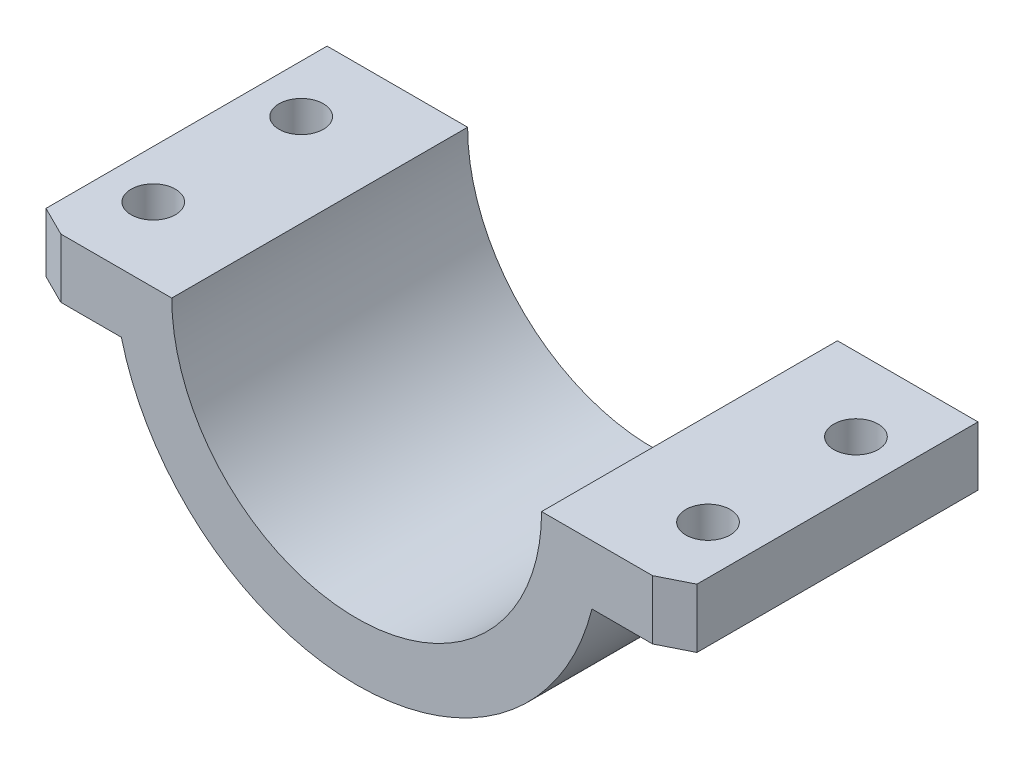
ISO-10303-21;
HEADER;
FILE_DESCRIPTION(('STEP AP214'),'2;1');
FILE_NAME('part.step','',(''),(''),'','','');
FILE_SCHEMA(('AUTOMOTIVE_DESIGN { 1 0 10303 214 1 1 1 1 }'));
ENDSEC;
DATA;
#1=APPLICATION_CONTEXT('core data for automotive mechanical design processes');
#2=APPLICATION_PROTOCOL_DEFINITION('international standard','automotive_design',2000,#1);
#3=PRODUCT_CONTEXT('',#1,'mechanical');
#4=PRODUCT('Part','Part','',(#3));
#5=PRODUCT_RELATED_PRODUCT_CATEGORY('part','',(#4));
#6=PRODUCT_DEFINITION_FORMATION('','',#4);
#7=PRODUCT_DEFINITION_CONTEXT('part definition',#1,'design');
#8=PRODUCT_DEFINITION('design','',#6,#7);
#9=PRODUCT_DEFINITION_SHAPE('','',#8);
#10=(LENGTH_UNIT() NAMED_UNIT(*) SI_UNIT(.MILLI.,.METRE.));
#11=(NAMED_UNIT(*) PLANE_ANGLE_UNIT() SI_UNIT($,.RADIAN.));
#12=(NAMED_UNIT(*) SI_UNIT($,.STERADIAN.) SOLID_ANGLE_UNIT());
#13=UNCERTAINTY_MEASURE_WITH_UNIT(LENGTH_MEASURE(1.E-05),#10,'distance_accuracy_value','');
#14=(GEOMETRIC_REPRESENTATION_CONTEXT(3) GLOBAL_UNCERTAINTY_ASSIGNED_CONTEXT((#13)) GLOBAL_UNIT_ASSIGNED_CONTEXT((#10,
#11,#12)) REPRESENTATION_CONTEXT('',''));
#15=CARTESIAN_POINT('',(0.,0.,0.));
#16=DIRECTION('',(0.,0.,1.));
#17=DIRECTION('',(1.,0.,0.));
#18=AXIS2_PLACEMENT_3D('',#15,#16,#17);
#19=CARTESIAN_POINT('',(-54.9481243354495,7.89485676799961,20.));
#20=DIRECTION('',(1.,0.,0.));
#21=DIRECTION('',(0.,0.,-1.));
#22=AXIS2_PLACEMENT_3D('',#19,#20,#21);
#23=PLANE('',#22);
#24=DIRECTION('',(0.,0.,-1.));
#25=VECTOR('',#24,1.);
#26=CARTESIAN_POINT('',(-54.9481243354495,7.89485676799961,20.));
#27=LINE('',#26,#25);
#28=CARTESIAN_POINT('',(-54.9481243354495,7.89485676799961,19.));
#29=VERTEX_POINT('',#28);
#30=CARTESIAN_POINT('',(-54.9481243354495,7.89485676799961,0.));
#31=VERTEX_POINT('',#30);
#32=EDGE_CURVE('E160',#29,#31,#27,.T.);
#33=ORIENTED_EDGE('',*,*,#32,.F.);
#34=DIRECTION('',(0.,1.,0.));
#35=VECTOR('',#34,1.);
#36=CARTESIAN_POINT('',(-54.9481243354495,-4.50514323200038,19.));
#37=LINE('',#36,#35);
#38=CARTESIAN_POINT('',(-54.9481243354495,11.8948567679996,19.));
#39=VERTEX_POINT('',#38);
#40=EDGE_CURVE('E178',#29,#39,#37,.T.);
#41=ORIENTED_EDGE('',*,*,#40,.T.);
#42=DIRECTION('',(0.,0.,-1.));
#43=VECTOR('',#42,1.);
#44=CARTESIAN_POINT('',(-54.9481243354495,11.8948567679996,20.));
#45=LINE('',#44,#43);
#46=CARTESIAN_POINT('',(-54.9481243354495,11.8948567679996,0.));
#47=VERTEX_POINT('',#46);
#48=EDGE_CURVE('E176',#39,#47,#45,.T.);
#49=ORIENTED_EDGE('',*,*,#48,.T.);
#50=DIRECTION('',(0.,-1.,0.));
#51=VECTOR('',#50,1.);
#52=CARTESIAN_POINT('',(-54.9481243354495,7.89485676799961,0.));
#53=LINE('',#52,#51);
#54=EDGE_CURVE('E192',#47,#31,#53,.T.);
#55=ORIENTED_EDGE('',*,*,#54,.T.);
#56=EDGE_LOOP('',(#33,#41,#49,#55));
#57=FACE_BOUND('',#56,.T.);
#58=ADVANCED_FACE('F43',(#57),#23,.F.);
#59=CARTESIAN_POINT('',(-48.8528406171064,7.89485676799961,20.));
#60=DIRECTION('',(0.,1.,0.));
#61=DIRECTION('',(0.,0.,1.));
#62=AXIS2_PLACEMENT_3D('',#59,#60,#61);
#63=PLANE('',#62);
#64=CARTESIAN_POINT('',(-51.6981243354495,7.89485676799961,15.));
#65=DIRECTION('',(0.,1.,0.));
#66=DIRECTION('',(0.,0.,1.));
#67=AXIS2_PLACEMENT_3D('',#64,#65,#66);
#68=CIRCLE('',#67,1.5);
#69=CARTESIAN_POINT('',(-51.6981243354495,7.89485676799961,16.5));
#70=VERTEX_POINT('',#69);
#71=EDGE_CURVE('E256',#70,#70,#68,.T.);
#72=ORIENTED_EDGE('',*,*,#71,.T.);
#73=EDGE_LOOP('',(#72));
#74=FACE_BOUND('',#73,.T.);
#75=CARTESIAN_POINT('',(-51.6981243354495,7.89485676799961,5.));
#76=DIRECTION('',(0.,1.,0.));
#77=DIRECTION('',(0.,0.,1.));
#78=AXIS2_PLACEMENT_3D('',#75,#76,#77);
#79=CIRCLE('',#78,1.5);
#80=CARTESIAN_POINT('',(-51.6981243354495,7.89485676799961,6.5));
#81=VERTEX_POINT('',#80);
#82=EDGE_CURVE('E252',#81,#81,#79,.T.);
#83=ORIENTED_EDGE('',*,*,#82,.T.);
#84=EDGE_LOOP('',(#83));
#85=FACE_BOUND('',#84,.T.);
#86=DIRECTION('',(1.,0.,0.));
#87=VECTOR('',#86,1.);
#88=CARTESIAN_POINT('',(-48.8528406171064,7.89485676799961,20.));
#89=LINE('',#88,#87);
#90=CARTESIAN_POINT('',(-52.9481243354496,7.89485676799961,20.));
#91=VERTEX_POINT('',#90);
#92=CARTESIAN_POINT('',(-48.8528406171064,7.89485676799962,20.));
#93=VERTEX_POINT('',#92);
#94=EDGE_CURVE('E217',#91,#93,#89,.T.);
#95=ORIENTED_EDGE('',*,*,#94,.F.);
#96=DIRECTION('',(-0.894427190999915,0.,-0.447213595499959));
#97=VECTOR('',#96,1.);
#98=CARTESIAN_POINT('',(-49.671897360775,7.89485676799961,21.6381134873373));
#99=LINE('',#98,#97);
#100=EDGE_CURVE('E65',#91,#29,#99,.T.);
#101=ORIENTED_EDGE('',*,*,#100,.T.);
#102=ORIENTED_EDGE('',*,*,#32,.T.);
#103=DIRECTION('',(1.,0.,0.));
#104=VECTOR('',#103,1.);
#105=CARTESIAN_POINT('',(-48.8528406171064,7.89485676799961,0.));
#106=LINE('',#105,#104);
#107=CARTESIAN_POINT('',(-48.8528406171064,7.89485676799962,0.));
#108=VERTEX_POINT('',#107);
#109=EDGE_CURVE('E196',#31,#108,#106,.T.);
#110=ORIENTED_EDGE('',*,*,#109,.T.);
#111=DIRECTION('',(0.,0.,-1.));
#112=VECTOR('',#111,1.);
#113=CARTESIAN_POINT('',(-48.8528406171064,7.89485676799962,20.));
#114=LINE('',#113,#112);
#115=EDGE_CURVE('E156',#93,#108,#114,.T.);
#116=ORIENTED_EDGE('',*,*,#115,.F.);
#117=EDGE_LOOP('',(#95,#101,#102,#110,#116));
#118=FACE_BOUND('',#117,.T.);
#119=ADVANCED_FACE('F288',(#74,#85,#118),#63,.F.);
#120=CARTESIAN_POINT('',(-32.9481243354495,11.8948567679996,20.));
#121=DIRECTION('',(0.,0.,-1.));
#122=DIRECTION('',(-1.,0.,0.));
#123=AXIS2_PLACEMENT_3D('',#120,#121,#122);
#124=CYLINDRICAL_SURFACE('',#123,16.4);
#125=CARTESIAN_POINT('',(-32.9481243354495,11.8948567679996,0.));
#126=DIRECTION('',(0.,0.,1.));
#127=DIRECTION('',(1.,0.,0.));
#128=AXIS2_PLACEMENT_3D('',#125,#126,#127);
#129=CIRCLE('',#128,16.4);
#130=CARTESIAN_POINT('',(-17.0434080537927,7.89485676799962,0.));
#131=VERTEX_POINT('',#130);
#132=EDGE_CURVE('E200',#108,#131,#129,.T.);
#133=ORIENTED_EDGE('',*,*,#132,.T.);
#134=DIRECTION('',(0.,0.,-1.));
#135=VECTOR('',#134,1.);
#136=CARTESIAN_POINT('',(-17.0434080537927,7.89485676799962,20.));
#137=LINE('',#136,#135);
#138=CARTESIAN_POINT('',(-17.0434080537927,7.89485676799962,20.));
#139=VERTEX_POINT('',#138);
#140=EDGE_CURVE('E146',#139,#131,#137,.T.);
#141=ORIENTED_EDGE('',*,*,#140,.F.);
#142=CARTESIAN_POINT('',(-32.9481243354495,11.8948567679996,20.));
#143=DIRECTION('',(0.,0.,1.));
#144=DIRECTION('',(1.,0.,0.));
#145=AXIS2_PLACEMENT_3D('',#142,#143,#144);
#146=CIRCLE('',#145,16.4);
#147=EDGE_CURVE('E269',#93,#139,#146,.T.);
#148=ORIENTED_EDGE('',*,*,#147,.F.);
#149=ORIENTED_EDGE('',*,*,#115,.T.);
#150=EDGE_LOOP('',(#133,#141,#148,#149));
#151=FACE_BOUND('',#150,.T.);
#152=ADVANCED_FACE('F292',(#151),#124,.T.);
#153=CARTESIAN_POINT('',(-10.9481243354495,7.89485676799962,20.));
#154=DIRECTION('',(0.,1.,0.));
#155=DIRECTION('',(-1.,0.,0.));
#156=AXIS2_PLACEMENT_3D('',#153,#154,#155);
#157=PLANE('',#156);
#158=CARTESIAN_POINT('',(-14.1981243354495,7.89485676799962,5.));
#159=DIRECTION('',(0.,1.,0.));
#160=DIRECTION('',(-1.,0.,0.));
#161=AXIS2_PLACEMENT_3D('',#158,#159,#160);
#162=CIRCLE('',#161,1.5);
#163=CARTESIAN_POINT('',(-15.6981243354496,7.89485676799962,5.));
#164=VERTEX_POINT('',#163);
#165=EDGE_CURVE('E197',#164,#164,#162,.T.);
#166=ORIENTED_EDGE('',*,*,#165,.T.);
#167=EDGE_LOOP('',(#166));
#168=FACE_BOUND('',#167,.T.);
#169=CARTESIAN_POINT('',(-14.1981243354495,7.89485676799962,15.));
#170=DIRECTION('',(0.,1.,0.));
#171=DIRECTION('',(-1.,0.,0.));
#172=AXIS2_PLACEMENT_3D('',#169,#170,#171);
#173=CIRCLE('',#172,1.5);
#174=CARTESIAN_POINT('',(-15.6981243354495,7.89485676799962,15.));
#175=VERTEX_POINT('',#174);
#176=EDGE_CURVE('E260',#175,#175,#173,.T.);
#177=ORIENTED_EDGE('',*,*,#176,.T.);
#178=EDGE_LOOP('',(#177));
#179=FACE_BOUND('',#178,.T.);
#180=DIRECTION('',(0.,0.,-1.));
#181=VECTOR('',#180,1.);
#182=CARTESIAN_POINT('',(-10.9481243354495,7.89485676799962,20.));
#183=LINE('',#182,#181);
#184=CARTESIAN_POINT('',(-10.9481243354495,7.89485676799962,19.));
#185=VERTEX_POINT('',#184);
#186=CARTESIAN_POINT('',(-10.9481243354495,7.89485676799962,0.));
#187=VERTEX_POINT('',#186);
#188=EDGE_CURVE('E141',#185,#187,#183,.T.);
#189=ORIENTED_EDGE('',*,*,#188,.F.);
#190=DIRECTION('',(-0.894427190999916,0.,0.447213595499958));
#191=VECTOR('',#190,1.);
#192=CARTESIAN_POINT('',(-11.3481243354495,7.89485676799962,19.2));
#193=LINE('',#192,#191);
#194=CARTESIAN_POINT('',(-12.9481243354495,7.89485676799962,20.));
#195=VERTEX_POINT('',#194);
#196=EDGE_CURVE('E120',#185,#195,#193,.T.);
#197=ORIENTED_EDGE('',*,*,#196,.T.);
#198=DIRECTION('',(1.,0.,0.));
#199=VECTOR('',#198,1.);
#200=CARTESIAN_POINT('',(-10.9481243354495,7.89485676799962,20.));
#201=LINE('',#200,#199);
#202=EDGE_CURVE('E272',#139,#195,#201,.T.);
#203=ORIENTED_EDGE('',*,*,#202,.F.);
#204=ORIENTED_EDGE('',*,*,#140,.T.);
#205=DIRECTION('',(1.,0.,0.));
#206=VECTOR('',#205,1.);
#207=CARTESIAN_POINT('',(-10.9481243354495,7.89485676799962,0.));
#208=LINE('',#207,#206);
#209=EDGE_CURVE('E203',#131,#187,#208,.T.);
#210=ORIENTED_EDGE('',*,*,#209,.T.);
#211=EDGE_LOOP('',(#189,#197,#203,#204,#210));
#212=FACE_BOUND('',#211,.T.);
#213=ADVANCED_FACE('F297',(#168,#179,#212),#157,.F.);
#214=CARTESIAN_POINT('',(-10.9481243354495,11.8948567679996,20.));
#215=DIRECTION('',(-1.,0.,0.));
#216=DIRECTION('',(0.,0.,1.));
#217=AXIS2_PLACEMENT_3D('',#214,#215,#216);
#218=PLANE('',#217);
#219=DIRECTION('',(0.,0.,-1.));
#220=VECTOR('',#219,1.);
#221=CARTESIAN_POINT('',(-10.9481243354495,11.8948567679996,20.));
#222=LINE('',#221,#220);
#223=CARTESIAN_POINT('',(-10.9481243354495,11.8948567679996,19.));
#224=VERTEX_POINT('',#223);
#225=CARTESIAN_POINT('',(-10.9481243354495,11.8948567679996,0.));
#226=VERTEX_POINT('',#225);
#227=EDGE_CURVE('E129',#224,#226,#222,.T.);
#228=ORIENTED_EDGE('',*,*,#227,.F.);
#229=DIRECTION('',(0.,1.,0.));
#230=VECTOR('',#229,1.);
#231=CARTESIAN_POINT('',(-10.9481243354495,-4.50514323200038,19.));
#232=LINE('',#231,#230);
#233=EDGE_CURVE('E117',#185,#224,#232,.T.);
#234=ORIENTED_EDGE('',*,*,#233,.F.);
#235=ORIENTED_EDGE('',*,*,#188,.T.);
#236=DIRECTION('',(0.,1.,0.));
#237=VECTOR('',#236,1.);
#238=CARTESIAN_POINT('',(-10.9481243354495,11.8948567679996,0.));
#239=LINE('',#238,#237);
#240=EDGE_CURVE('E138',#187,#226,#239,.T.);
#241=ORIENTED_EDGE('',*,*,#240,.T.);
#242=EDGE_LOOP('',(#228,#234,#235,#241));
#243=FACE_BOUND('',#242,.T.);
#244=ADVANCED_FACE('F136',(#243),#218,.F.);
#245=CARTESIAN_POINT('',(-20.4481243354495,11.8948567679996,20.));
#246=DIRECTION('',(0.,-1.,0.));
#247=DIRECTION('',(0.,0.,-1.));
#248=AXIS2_PLACEMENT_3D('',#245,#246,#247);
#249=PLANE('',#248);
#250=CARTESIAN_POINT('',(-14.1981243354495,11.8948567679996,5.));
#251=DIRECTION('',(0.,1.,0.));
#252=DIRECTION('',(0.,0.,1.));
#253=AXIS2_PLACEMENT_3D('',#250,#251,#252);
#254=CIRCLE('',#253,1.5);
#255=CARTESIAN_POINT('',(-14.1981243354495,11.8948567679996,6.5));
#256=VERTEX_POINT('',#255);
#257=EDGE_CURVE('E240',#256,#256,#254,.T.);
#258=ORIENTED_EDGE('',*,*,#257,.F.);
#259=EDGE_LOOP('',(#258));
#260=FACE_BOUND('',#259,.T.);
#261=CARTESIAN_POINT('',(-14.1981243354495,11.8948567679996,15.));
#262=DIRECTION('',(0.,1.,0.));
#263=DIRECTION('',(0.,0.,1.));
#264=AXIS2_PLACEMENT_3D('',#261,#262,#263);
#265=CIRCLE('',#264,1.5);
#266=CARTESIAN_POINT('',(-14.1981243354495,11.8948567679996,16.5));
#267=VERTEX_POINT('',#266);
#268=EDGE_CURVE('E236',#267,#267,#265,.T.);
#269=ORIENTED_EDGE('',*,*,#268,.F.);
#270=EDGE_LOOP('',(#269));
#271=FACE_BOUND('',#270,.T.);
#272=DIRECTION('',(-1.,0.,0.));
#273=VECTOR('',#272,1.);
#274=CARTESIAN_POINT('',(-20.4481243354495,11.8948567679996,20.));
#275=LINE('',#274,#273);
#276=CARTESIAN_POINT('',(-12.9481243354495,11.8948567679996,20.));
#277=VERTEX_POINT('',#276);
#278=CARTESIAN_POINT('',(-20.4481243354495,11.8948567679996,20.));
#279=VERTEX_POINT('',#278);
#280=EDGE_CURVE('E132',#277,#279,#275,.T.);
#281=ORIENTED_EDGE('',*,*,#280,.F.);
#282=DIRECTION('',(-0.894427190999916,0.,0.447213595499958));
#283=VECTOR('',#282,1.);
#284=CARTESIAN_POINT('',(-12.9481243354495,11.8948567679996,20.));
#285=LINE('',#284,#283);
#286=EDGE_CURVE('E57',#224,#277,#285,.T.);
#287=ORIENTED_EDGE('',*,*,#286,.F.);
#288=ORIENTED_EDGE('',*,*,#227,.T.);
#289=DIRECTION('',(-1.,0.,0.));
#290=VECTOR('',#289,1.);
#291=CARTESIAN_POINT('',(-20.4481243354495,11.8948567679996,0.));
#292=LINE('',#291,#290);
#293=CARTESIAN_POINT('',(-20.4481243354495,11.8948567679996,0.));
#294=VERTEX_POINT('',#293);
#295=EDGE_CURVE('E209',#226,#294,#292,.T.);
#296=ORIENTED_EDGE('',*,*,#295,.T.);
#297=DIRECTION('',(0.,0.,-1.));
#298=VECTOR('',#297,1.);
#299=CARTESIAN_POINT('',(-20.4481243354495,11.8948567679996,20.));
#300=LINE('',#299,#298);
#301=EDGE_CURVE('E142',#279,#294,#300,.T.);
#302=ORIENTED_EDGE('',*,*,#301,.F.);
#303=EDGE_LOOP('',(#281,#287,#288,#296,#302));
#304=FACE_BOUND('',#303,.T.);
#305=ADVANCED_FACE('F128',(#260,#271,#304),#249,.F.);
#306=CARTESIAN_POINT('',(-32.9481243354495,11.8948567679996,20.));
#307=DIRECTION('',(0.,0.,-1.));
#308=DIRECTION('',(-1.,0.,0.));
#309=AXIS2_PLACEMENT_3D('',#306,#307,#308);
#310=CYLINDRICAL_SURFACE('',#309,12.5);
#311=CARTESIAN_POINT('',(-32.9481243354495,11.8948567679996,0.));
#312=DIRECTION('',(0.,0.,-1.));
#313=DIRECTION('',(1.,0.,0.));
#314=AXIS2_PLACEMENT_3D('',#311,#312,#313);
#315=CIRCLE('',#314,12.5);
#316=CARTESIAN_POINT('',(-45.4481243354495,11.8948567679996,0.));
#317=VERTEX_POINT('',#316);
#318=EDGE_CURVE('E212',#294,#317,#315,.T.);
#319=ORIENTED_EDGE('',*,*,#318,.T.);
#320=DIRECTION('',(0.,0.,-1.));
#321=VECTOR('',#320,1.);
#322=CARTESIAN_POINT('',(-45.4481243354495,11.8948567679996,20.));
#323=LINE('',#322,#321);
#324=CARTESIAN_POINT('',(-45.4481243354495,11.8948567679996,20.));
#325=VERTEX_POINT('',#324);
#326=EDGE_CURVE('E149',#325,#317,#323,.T.);
#327=ORIENTED_EDGE('',*,*,#326,.F.);
#328=CARTESIAN_POINT('',(-32.9481243354495,11.8948567679996,20.));
#329=DIRECTION('',(0.,0.,-1.));
#330=DIRECTION('',(1.,0.,0.));
#331=AXIS2_PLACEMENT_3D('',#328,#329,#330);
#332=CIRCLE('',#331,12.5);
#333=EDGE_CURVE('E182',#279,#325,#332,.T.);
#334=ORIENTED_EDGE('',*,*,#333,.F.);
#335=ORIENTED_EDGE('',*,*,#301,.T.);
#336=EDGE_LOOP('',(#319,#327,#334,#335));
#337=FACE_BOUND('',#336,.T.);
#338=ADVANCED_FACE('F276',(#337),#310,.F.);
#339=CARTESIAN_POINT('',(-54.9481243354495,11.8948567679996,20.));
#340=DIRECTION('',(0.,-1.,0.));
#341=DIRECTION('',(0.,0.,-1.));
#342=AXIS2_PLACEMENT_3D('',#339,#340,#341);
#343=PLANE('',#342);
#344=CARTESIAN_POINT('',(-51.6981243354495,11.8948567679996,15.));
#345=DIRECTION('',(0.,1.,0.));
#346=DIRECTION('',(0.,0.,1.));
#347=AXIS2_PLACEMENT_3D('',#344,#345,#346);
#348=CIRCLE('',#347,1.5);
#349=CARTESIAN_POINT('',(-51.6981243354495,11.8948567679996,16.5));
#350=VERTEX_POINT('',#349);
#351=EDGE_CURVE('E241',#350,#350,#348,.T.);
#352=ORIENTED_EDGE('',*,*,#351,.F.);
#353=EDGE_LOOP('',(#352));
#354=FACE_BOUND('',#353,.T.);
#355=CARTESIAN_POINT('',(-51.6981243354495,11.8948567679996,5.));
#356=DIRECTION('',(0.,1.,0.));
#357=DIRECTION('',(0.,0.,1.));
#358=AXIS2_PLACEMENT_3D('',#355,#356,#357);
#359=CIRCLE('',#358,1.5);
#360=CARTESIAN_POINT('',(-51.6981243354495,11.8948567679996,6.5));
#361=VERTEX_POINT('',#360);
#362=EDGE_CURVE('E245',#361,#361,#359,.T.);
#363=ORIENTED_EDGE('',*,*,#362,.F.);
#364=EDGE_LOOP('',(#363));
#365=FACE_BOUND('',#364,.T.);
#366=ORIENTED_EDGE('',*,*,#48,.F.);
#367=DIRECTION('',(-0.894427190999915,0.,-0.447213595499959));
#368=VECTOR('',#367,1.);
#369=CARTESIAN_POINT('',(-54.9481243354495,11.8948567679996,19.));
#370=LINE('',#369,#368);
#371=CARTESIAN_POINT('',(-52.9481243354495,11.8948567679996,20.));
#372=VERTEX_POINT('',#371);
#373=EDGE_CURVE('E134',#372,#39,#370,.T.);
#374=ORIENTED_EDGE('',*,*,#373,.F.);
#375=DIRECTION('',(-1.,0.,0.));
#376=VECTOR('',#375,1.);
#377=CARTESIAN_POINT('',(-54.9481243354495,11.8948567679996,20.));
#378=LINE('',#377,#376);
#379=EDGE_CURVE('E174',#325,#372,#378,.T.);
#380=ORIENTED_EDGE('',*,*,#379,.F.);
#381=ORIENTED_EDGE('',*,*,#326,.T.);
#382=DIRECTION('',(-1.,0.,0.));
#383=VECTOR('',#382,1.);
#384=CARTESIAN_POINT('',(-54.9481243354495,11.8948567679996,0.));
#385=LINE('',#384,#383);
#386=EDGE_CURVE('E215',#317,#47,#385,.T.);
#387=ORIENTED_EDGE('',*,*,#386,.T.);
#388=EDGE_LOOP('',(#366,#374,#380,#381,#387));
#389=FACE_BOUND('',#388,.T.);
#390=ADVANCED_FACE('F172',(#354,#365,#389),#343,.F.);
#391=CARTESIAN_POINT('',(-32.9481243354495,11.8948567679996,20.));
#392=DIRECTION('',(0.,0.,1.));
#393=DIRECTION('',(1.,0.,0.));
#394=AXIS2_PLACEMENT_3D('',#391,#392,#393);
#395=PLANE('',#394);
#396=DIRECTION('',(0.,-1.,0.));
#397=VECTOR('',#396,1.);
#398=CARTESIAN_POINT('',(-12.9481243354496,11.8948567679996,20.));
#399=LINE('',#398,#397);
#400=EDGE_CURVE('E11',#277,#195,#399,.T.);
#401=ORIENTED_EDGE('',*,*,#400,.F.);
#402=ORIENTED_EDGE('',*,*,#280,.T.);
#403=ORIENTED_EDGE('',*,*,#333,.T.);
#404=ORIENTED_EDGE('',*,*,#379,.T.);
#405=DIRECTION('',(0.,1.,0.));
#406=VECTOR('',#405,1.);
#407=CARTESIAN_POINT('',(-52.9481243354496,11.8948567679996,20.));
#408=LINE('',#407,#406);
#409=EDGE_CURVE('E51',#91,#372,#408,.T.);
#410=ORIENTED_EDGE('',*,*,#409,.F.);
#411=ORIENTED_EDGE('',*,*,#94,.T.);
#412=ORIENTED_EDGE('',*,*,#147,.T.);
#413=ORIENTED_EDGE('',*,*,#202,.T.);
#414=EDGE_LOOP('',(#401,#402,#403,#404,#410,#411,#412,#413));
#415=FACE_BOUND('',#414,.T.);
#416=ADVANCED_FACE('F180',(#415),#395,.T.);
#417=CARTESIAN_POINT('',(-32.9481243354495,11.8948567679996,0.));
#418=DIRECTION('',(0.,0.,1.));
#419=DIRECTION('',(1.,0.,0.));
#420=AXIS2_PLACEMENT_3D('',#417,#418,#419);
#421=PLANE('',#420);
#422=ORIENTED_EDGE('',*,*,#54,.F.);
#423=ORIENTED_EDGE('',*,*,#386,.F.);
#424=ORIENTED_EDGE('',*,*,#318,.F.);
#425=ORIENTED_EDGE('',*,*,#295,.F.);
#426=ORIENTED_EDGE('',*,*,#240,.F.);
#427=ORIENTED_EDGE('',*,*,#209,.F.);
#428=ORIENTED_EDGE('',*,*,#132,.F.);
#429=ORIENTED_EDGE('',*,*,#109,.F.);
#430=EDGE_LOOP('',(#422,#423,#424,#425,#426,#427,#428,#429));
#431=FACE_BOUND('',#430,.T.);
#432=ADVANCED_FACE('F224',(#431),#421,.F.);
#433=CARTESIAN_POINT('',(-51.6981243354495,-4.50514323200038,5.));
#434=DIRECTION('',(0.,1.,0.));
#435=DIRECTION('',(0.,0.,1.));
#436=AXIS2_PLACEMENT_3D('',#433,#434,#435);
#437=CYLINDRICAL_SURFACE('',#436,1.5);
#438=ORIENTED_EDGE('',*,*,#362,.T.);
#439=EDGE_LOOP('',(#438));
#440=FACE_BOUND('',#439,.T.);
#441=ORIENTED_EDGE('',*,*,#82,.F.);
#442=EDGE_LOOP('',(#441));
#443=FACE_BOUND('',#442,.T.);
#444=ADVANCED_FACE('F384',(#440,#443),#437,.F.);
#445=CARTESIAN_POINT('',(-51.6981243354495,-4.50514323200038,15.));
#446=DIRECTION('',(0.,1.,0.));
#447=DIRECTION('',(0.,0.,1.));
#448=AXIS2_PLACEMENT_3D('',#445,#446,#447);
#449=CYLINDRICAL_SURFACE('',#448,1.5);
#450=ORIENTED_EDGE('',*,*,#351,.T.);
#451=EDGE_LOOP('',(#450));
#452=FACE_BOUND('',#451,.T.);
#453=ORIENTED_EDGE('',*,*,#71,.F.);
#454=EDGE_LOOP('',(#453));
#455=FACE_BOUND('',#454,.T.);
#456=ADVANCED_FACE('F374',(#452,#455),#449,.F.);
#457=CARTESIAN_POINT('',(-14.1981243354495,-4.50514323200038,15.));
#458=DIRECTION('',(0.,1.,0.));
#459=DIRECTION('',(0.,0.,1.));
#460=AXIS2_PLACEMENT_3D('',#457,#458,#459);
#461=CYLINDRICAL_SURFACE('',#460,1.5);
#462=ORIENTED_EDGE('',*,*,#268,.T.);
#463=EDGE_LOOP('',(#462));
#464=FACE_BOUND('',#463,.T.);
#465=ORIENTED_EDGE('',*,*,#176,.F.);
#466=EDGE_LOOP('',(#465));
#467=FACE_BOUND('',#466,.T.);
#468=ADVANCED_FACE('F364',(#464,#467),#461,.F.);
#469=CARTESIAN_POINT('',(-14.1981243354495,-4.50514323200038,5.));
#470=DIRECTION('',(0.,1.,0.));
#471=DIRECTION('',(0.,0.,1.));
#472=AXIS2_PLACEMENT_3D('',#469,#470,#471);
#473=CYLINDRICAL_SURFACE('',#472,1.5);
#474=ORIENTED_EDGE('',*,*,#257,.T.);
#475=EDGE_LOOP('',(#474));
#476=FACE_BOUND('',#475,.T.);
#477=ORIENTED_EDGE('',*,*,#165,.F.);
#478=EDGE_LOOP('',(#477));
#479=FACE_BOUND('',#478,.T.);
#480=ADVANCED_FACE('F343',(#476,#479),#473,.F.);
#481=CARTESIAN_POINT('',(-54.9481243354495,-4.50514323200038,19.));
#482=DIRECTION('',(0.447213595499959,0.,-0.894427190999915));
#483=DIRECTION('',(-0.894427190999915,0.,-0.447213595499959));
#484=AXIS2_PLACEMENT_3D('',#481,#482,#483);
#485=PLANE('',#484);
#486=ORIENTED_EDGE('',*,*,#409,.T.);
#487=ORIENTED_EDGE('',*,*,#373,.T.);
#488=ORIENTED_EDGE('',*,*,#40,.F.);
#489=ORIENTED_EDGE('',*,*,#100,.F.);
#490=EDGE_LOOP('',(#486,#487,#488,#489));
#491=FACE_BOUND('',#490,.T.);
#492=ADVANCED_FACE('F164',(#491),#485,.F.);
#493=CARTESIAN_POINT('',(-12.9481243354495,-4.50514323200038,20.));
#494=DIRECTION('',(-0.447213595499958,0.,-0.894427190999916));
#495=DIRECTION('',(-0.894427190999916,0.,0.447213595499958));
#496=AXIS2_PLACEMENT_3D('',#493,#494,#495);
#497=PLANE('',#496);
#498=ORIENTED_EDGE('',*,*,#233,.T.);
#499=ORIENTED_EDGE('',*,*,#286,.T.);
#500=ORIENTED_EDGE('',*,*,#400,.T.);
#501=ORIENTED_EDGE('',*,*,#196,.F.);
#502=EDGE_LOOP('',(#498,#499,#500,#501));
#503=FACE_BOUND('',#502,.T.);
#504=ADVANCED_FACE('F118',(#503),#497,.F.);
#505=CLOSED_SHELL('',(#58,#119,#152,#213,#244,#305,#338,#390,#416,#432,#444,#456,#468,#480,#492,#504));
#506=MANIFOLD_SOLID_BREP('B2',#505);
#507=ADVANCED_BREP_SHAPE_REPRESENTATION('',(#18,#506),#14);
#508=SHAPE_DEFINITION_REPRESENTATION(#9,#507);
ENDSEC;
END-ISO-10303-21;
